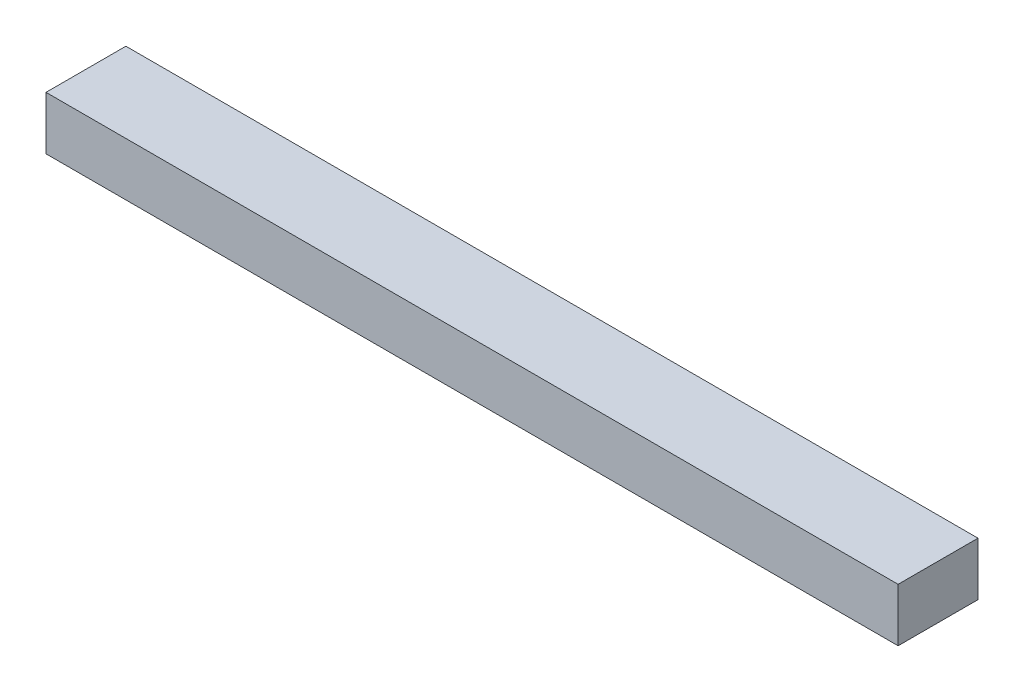
ISO-10303-21;
HEADER;
FILE_DESCRIPTION(('STEP AP214'),'2;1');
FILE_NAME('part.step','',(''),(''),'','','');
FILE_SCHEMA(('AUTOMOTIVE_DESIGN { 1 0 10303 214 1 1 1 1 }'));
ENDSEC;
DATA;
#1=APPLICATION_CONTEXT('core data for automotive mechanical design processes');
#2=APPLICATION_PROTOCOL_DEFINITION('international standard','automotive_design',2000,#1);
#3=PRODUCT_CONTEXT('',#1,'mechanical');
#4=PRODUCT('Part','Part','',(#3));
#5=PRODUCT_RELATED_PRODUCT_CATEGORY('part','',(#4));
#6=PRODUCT_DEFINITION_FORMATION('','',#4);
#7=PRODUCT_DEFINITION_CONTEXT('part definition',#1,'design');
#8=PRODUCT_DEFINITION('design','',#6,#7);
#9=PRODUCT_DEFINITION_SHAPE('','',#8);
#10=(LENGTH_UNIT() NAMED_UNIT(*) SI_UNIT(.MILLI.,.METRE.));
#11=(NAMED_UNIT(*) PLANE_ANGLE_UNIT() SI_UNIT($,.RADIAN.));
#12=(NAMED_UNIT(*) SI_UNIT($,.STERADIAN.) SOLID_ANGLE_UNIT());
#13=UNCERTAINTY_MEASURE_WITH_UNIT(LENGTH_MEASURE(1.E-05),#10,'distance_accuracy_value','');
#14=(GEOMETRIC_REPRESENTATION_CONTEXT(3) GLOBAL_UNCERTAINTY_ASSIGNED_CONTEXT((#13)) GLOBAL_UNIT_ASSIGNED_CONTEXT((#10,
#11,#12)) REPRESENTATION_CONTEXT('',''));
#15=CARTESIAN_POINT('',(0.,0.,0.));
#16=DIRECTION('',(0.,0.,1.));
#17=DIRECTION('',(1.,0.,0.));
#18=AXIS2_PLACEMENT_3D('',#15,#16,#17);
#19=CARTESIAN_POINT('',(160.,20.,15.));
#20=DIRECTION('',(-1.,0.,0.));
#21=DIRECTION('',(0.,0.,1.));
#22=AXIS2_PLACEMENT_3D('',#19,#20,#21);
#23=PLANE('',#22);
#24=DIRECTION('',(0.,0.,-1.));
#25=VECTOR('',#24,1.);
#26=CARTESIAN_POINT('',(160.,0.,15.));
#27=LINE('',#26,#25);
#28=CARTESIAN_POINT('',(160.,0.,15.));
#29=VERTEX_POINT('',#28);
#30=CARTESIAN_POINT('',(160.,0.,-15.));
#31=VERTEX_POINT('',#30);
#32=EDGE_CURVE('E113',#29,#31,#27,.T.);
#33=ORIENTED_EDGE('',*,*,#32,.T.);
#34=DIRECTION('',(0.,-1.,0.));
#35=VECTOR('',#34,1.);
#36=CARTESIAN_POINT('',(160.,20.,-15.));
#37=LINE('',#36,#35);
#38=CARTESIAN_POINT('',(160.,20.,-15.));
#39=VERTEX_POINT('',#38);
#40=EDGE_CURVE('E11',#39,#31,#37,.T.);
#41=ORIENTED_EDGE('',*,*,#40,.F.);
#42=DIRECTION('',(0.,0.,-1.));
#43=VECTOR('',#42,1.);
#44=CARTESIAN_POINT('',(160.,20.,15.));
#45=LINE('',#44,#43);
#46=CARTESIAN_POINT('',(160.,20.,15.));
#47=VERTEX_POINT('',#46);
#48=EDGE_CURVE('E97',#47,#39,#45,.T.);
#49=ORIENTED_EDGE('',*,*,#48,.F.);
#50=DIRECTION('',(0.,-1.,0.));
#51=VECTOR('',#50,1.);
#52=CARTESIAN_POINT('',(160.,20.,15.));
#53=LINE('',#52,#51);
#54=EDGE_CURVE('E109',#47,#29,#53,.T.);
#55=ORIENTED_EDGE('',*,*,#54,.T.);
#56=EDGE_LOOP('',(#33,#41,#49,#55));
#57=FACE_BOUND('',#56,.T.);
#58=ADVANCED_FACE('F45',(#57),#23,.F.);
#59=CARTESIAN_POINT('',(-160.,20.,-15.));
#60=DIRECTION('',(0.,0.,1.));
#61=DIRECTION('',(1.,0.,0.));
#62=AXIS2_PLACEMENT_3D('',#59,#60,#61);
#63=PLANE('',#62);
#64=DIRECTION('',(-1.,0.,0.));
#65=VECTOR('',#64,1.);
#66=CARTESIAN_POINT('',(-160.,0.,-15.));
#67=LINE('',#66,#65);
#68=CARTESIAN_POINT('',(-160.,0.,-15.));
#69=VERTEX_POINT('',#68);
#70=EDGE_CURVE('E102',#31,#69,#67,.T.);
#71=ORIENTED_EDGE('',*,*,#70,.T.);
#72=DIRECTION('',(0.,-1.,0.));
#73=VECTOR('',#72,1.);
#74=CARTESIAN_POINT('',(-160.,20.,-15.));
#75=LINE('',#74,#73);
#76=CARTESIAN_POINT('',(-160.,20.,-15.));
#77=VERTEX_POINT('',#76);
#78=EDGE_CURVE('E54',#77,#69,#75,.T.);
#79=ORIENTED_EDGE('',*,*,#78,.F.);
#80=DIRECTION('',(-1.,0.,0.));
#81=VECTOR('',#80,1.);
#82=CARTESIAN_POINT('',(-160.,20.,-15.));
#83=LINE('',#82,#81);
#84=EDGE_CURVE('E92',#39,#77,#83,.T.);
#85=ORIENTED_EDGE('',*,*,#84,.F.);
#86=ORIENTED_EDGE('',*,*,#40,.T.);
#87=EDGE_LOOP('',(#71,#79,#85,#86));
#88=FACE_BOUND('',#87,.T.);
#89=ADVANCED_FACE('F101',(#88),#63,.F.);
#90=CARTESIAN_POINT('',(-160.,20.,15.));
#91=DIRECTION('',(1.,0.,0.));
#92=DIRECTION('',(0.,0.,-1.));
#93=AXIS2_PLACEMENT_3D('',#90,#91,#92);
#94=PLANE('',#93);
#95=DIRECTION('',(0.,0.,1.));
#96=VECTOR('',#95,1.);
#97=CARTESIAN_POINT('',(-160.,0.,15.));
#98=LINE('',#97,#96);
#99=CARTESIAN_POINT('',(-160.,0.,15.));
#100=VERTEX_POINT('',#99);
#101=EDGE_CURVE('E79',#69,#100,#98,.T.);
#102=ORIENTED_EDGE('',*,*,#101,.T.);
#103=DIRECTION('',(0.,-1.,0.));
#104=VECTOR('',#103,1.);
#105=CARTESIAN_POINT('',(-160.,20.,15.));
#106=LINE('',#105,#104);
#107=CARTESIAN_POINT('',(-160.,20.,15.));
#108=VERTEX_POINT('',#107);
#109=EDGE_CURVE('E104',#108,#100,#106,.T.);
#110=ORIENTED_EDGE('',*,*,#109,.F.);
#111=DIRECTION('',(0.,0.,1.));
#112=VECTOR('',#111,1.);
#113=CARTESIAN_POINT('',(-160.,20.,15.));
#114=LINE('',#113,#112);
#115=EDGE_CURVE('E95',#77,#108,#114,.T.);
#116=ORIENTED_EDGE('',*,*,#115,.F.);
#117=ORIENTED_EDGE('',*,*,#78,.T.);
#118=EDGE_LOOP('',(#102,#110,#116,#117));
#119=FACE_BOUND('',#118,.T.);
#120=ADVANCED_FACE('F105',(#119),#94,.F.);
#121=CARTESIAN_POINT('',(-160.,20.,15.));
#122=DIRECTION('',(0.,0.,-1.));
#123=DIRECTION('',(-1.,0.,0.));
#124=AXIS2_PLACEMENT_3D('',#121,#122,#123);
#125=PLANE('',#124);
#126=DIRECTION('',(1.,0.,0.));
#127=VECTOR('',#126,1.);
#128=CARTESIAN_POINT('',(-160.,0.,15.));
#129=LINE('',#128,#127);
#130=EDGE_CURVE('E85',#100,#29,#129,.T.);
#131=ORIENTED_EDGE('',*,*,#130,.T.);
#132=ORIENTED_EDGE('',*,*,#54,.F.);
#133=DIRECTION('',(1.,0.,0.));
#134=VECTOR('',#133,1.);
#135=CARTESIAN_POINT('',(-160.,20.,15.));
#136=LINE('',#135,#134);
#137=EDGE_CURVE('E62',#108,#47,#136,.T.);
#138=ORIENTED_EDGE('',*,*,#137,.F.);
#139=ORIENTED_EDGE('',*,*,#109,.T.);
#140=EDGE_LOOP('',(#131,#132,#138,#139));
#141=FACE_BOUND('',#140,.T.);
#142=ADVANCED_FACE('F126',(#141),#125,.F.);
#143=CARTESIAN_POINT('',(0.,20.,0.));
#144=DIRECTION('',(0.,-1.,0.));
#145=DIRECTION('',(0.,0.,-1.));
#146=AXIS2_PLACEMENT_3D('',#143,#144,#145);
#147=PLANE('',#146);
#148=ORIENTED_EDGE('',*,*,#48,.T.);
#149=ORIENTED_EDGE('',*,*,#84,.T.);
#150=ORIENTED_EDGE('',*,*,#115,.T.);
#151=ORIENTED_EDGE('',*,*,#137,.T.);
#152=EDGE_LOOP('',(#148,#149,#150,#151));
#153=FACE_BOUND('',#152,.T.);
#154=ADVANCED_FACE('F93',(#153),#147,.F.);
#155=CARTESIAN_POINT('',(0.,0.,0.));
#156=DIRECTION('',(0.,-1.,0.));
#157=DIRECTION('',(0.,0.,-1.));
#158=AXIS2_PLACEMENT_3D('',#155,#156,#157);
#159=PLANE('',#158);
#160=ORIENTED_EDGE('',*,*,#32,.F.);
#161=ORIENTED_EDGE('',*,*,#130,.F.);
#162=ORIENTED_EDGE('',*,*,#101,.F.);
#163=ORIENTED_EDGE('',*,*,#70,.F.);
#164=EDGE_LOOP('',(#160,#161,#162,#163));
#165=FACE_BOUND('',#164,.T.);
#166=ADVANCED_FACE('F129',(#165),#159,.T.);
#167=CLOSED_SHELL('',(#58,#89,#120,#142,#154,#166));
#168=MANIFOLD_SOLID_BREP('B2',#167);
#169=ADVANCED_BREP_SHAPE_REPRESENTATION('',(#18,#168),#14);
#170=SHAPE_DEFINITION_REPRESENTATION(#9,#169);
ENDSEC;
END-ISO-10303-21;
